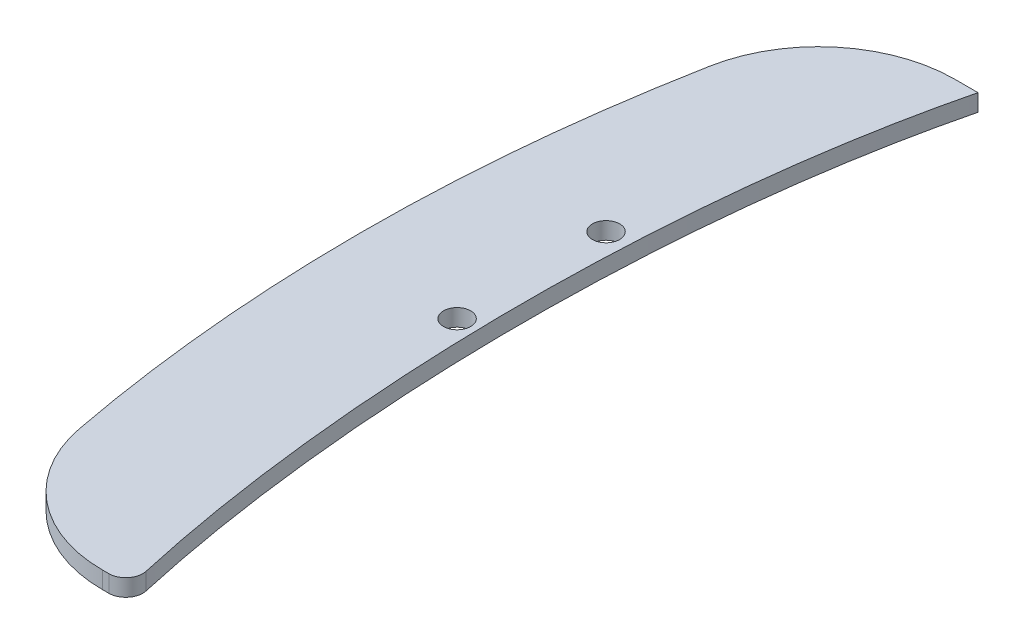
ISO-10303-21;
HEADER;
FILE_DESCRIPTION(('STEP AP214'),'2;1');
FILE_NAME('part.step','',(''),(''),'','','');
FILE_SCHEMA(('AUTOMOTIVE_DESIGN { 1 0 10303 214 1 1 1 1 }'));
ENDSEC;
DATA;
#1=APPLICATION_CONTEXT('core data for automotive mechanical design processes');
#2=APPLICATION_PROTOCOL_DEFINITION('international standard','automotive_design',2000,#1);
#3=PRODUCT_CONTEXT('',#1,'mechanical');
#4=PRODUCT('Part','Part','',(#3));
#5=PRODUCT_RELATED_PRODUCT_CATEGORY('part','',(#4));
#6=PRODUCT_DEFINITION_FORMATION('','',#4);
#7=PRODUCT_DEFINITION_CONTEXT('part definition',#1,'design');
#8=PRODUCT_DEFINITION('design','',#6,#7);
#9=PRODUCT_DEFINITION_SHAPE('','',#8);
#10=(LENGTH_UNIT() NAMED_UNIT(*) SI_UNIT(.MILLI.,.METRE.));
#11=(NAMED_UNIT(*) PLANE_ANGLE_UNIT() SI_UNIT($,.RADIAN.));
#12=(NAMED_UNIT(*) SI_UNIT($,.STERADIAN.) SOLID_ANGLE_UNIT());
#13=UNCERTAINTY_MEASURE_WITH_UNIT(LENGTH_MEASURE(1.E-05),#10,'distance_accuracy_value','');
#14=(GEOMETRIC_REPRESENTATION_CONTEXT(3) GLOBAL_UNCERTAINTY_ASSIGNED_CONTEXT((#13)) GLOBAL_UNIT_ASSIGNED_CONTEXT((#10,
#11,#12)) REPRESENTATION_CONTEXT('',''));
#15=CARTESIAN_POINT('',(0.,0.,0.));
#16=DIRECTION('',(0.,0.,1.));
#17=DIRECTION('',(1.,0.,0.));
#18=AXIS2_PLACEMENT_3D('',#15,#16,#17);
#19=CARTESIAN_POINT('',(7.98093404356032,2.5,-0.369809069035212));
#20=DIRECTION('',(0.,-1.,0.));
#21=DIRECTION('',(0.,0.,-1.));
#22=AXIS2_PLACEMENT_3D('',#19,#20,#21);
#23=PLANE('',#22);
#24=CARTESIAN_POINT('',(14.4139230516023,2.5,59.972626608733));
#25=CARTESIAN_POINT('',(10.3600323582731,2.5,41.9835802863605));
#26=CARTESIAN_POINT('',(5.80089976046676,2.5,-0.158887719398999));
#27=CARTESIAN_POINT('',(9.96190429503463,2.5,-43.1450411237033));
#28=CARTESIAN_POINT('',(14.6281507340815,2.5,-61.9777728446062));
#29=B_SPLINE_CURVE_WITH_KNOTS('',3,(#24,#25,#26,#27,#28),.UNSPECIFIED.,.F.,.F.,(4,1,4),(0.,
0.486126784039774,0.972253568079549),.UNSPECIFIED.);
#30=CARTESIAN_POINT('',(14.4139230516023,2.5,59.972626608733));
#31=VERTEX_POINT('',#30);
#32=CARTESIAN_POINT('',(14.6281507340815,2.5,-61.9777728446062));
#33=VERTEX_POINT('',#32);
#34=EDGE_CURVE('E166',#31,#33,#29,.T.);
#35=ORIENTED_EDGE('',*,*,#34,.T.);
#36=DIRECTION('',(-1.,0.,0.));
#37=VECTOR('',#36,1.);
#38=CARTESIAN_POINT('',(11.2219847975286,2.5,-61.9777728446062));
#39=LINE('',#38,#37);
#40=CARTESIAN_POINT('',(11.2219847975286,2.5,-61.9777728446062));
#41=VERTEX_POINT('',#40);
#42=EDGE_CURVE('E98',#33,#41,#39,.T.);
#43=ORIENTED_EDGE('',*,*,#42,.T.);
#44=CARTESIAN_POINT('',(11.2219847975286,2.5,-41.9777728446062));
#45=DIRECTION('',(0.,1.,0.));
#46=DIRECTION('',(0.,0.,-1.));
#47=AXIS2_PLACEMENT_3D('',#44,#45,#46);
#48=CIRCLE('',#47,20.);
#49=CARTESIAN_POINT('',(-8.43603740992544,2.5,-45.660457041119));
#50=VERTEX_POINT('',#49);
#51=EDGE_CURVE('E183',#41,#50,#48,.T.);
#52=ORIENTED_EDGE('',*,*,#51,.T.);
#53=CARTESIAN_POINT('',(-8.43603740992544,2.5,-45.660457041119));
#54=CARTESIAN_POINT('',(-10.9283676737998,2.5,-32.3564969236739));
#55=CARTESIAN_POINT('',(-14.334494691742,2.5,-2.38288746136294));
#56=CARTESIAN_POINT('',(-11.9604730634743,2.5,29.4177292586213));
#57=CARTESIAN_POINT('',(-8.59564883827233,2.5,46.8191851875977));
#58=B_SPLINE_CURVE_WITH_KNOTS('',3,(#53,#54,#55,#56,#57),.UNSPECIFIED.,.F.,.F.,(4,1,4),
(0.126810365029956,0.438278247696197,0.866480416364856),.UNSPECIFIED.);
#59=CARTESIAN_POINT('',(-8.59564883827233,2.5,46.8191851875977));
#60=VERTEX_POINT('',#59);
#61=EDGE_CURVE('E114',#50,#60,#58,.T.);
#62=ORIENTED_EDGE('',*,*,#61,.T.);
#63=CARTESIAN_POINT('',(11.0406214211655,2.5,43.0222271553938));
#64=DIRECTION('',(0.,1.,0.));
#65=DIRECTION('',(0.,0.,1.));
#66=AXIS2_PLACEMENT_3D('',#63,#64,#65);
#67=CIRCLE('',#66,20.);
#68=CARTESIAN_POINT('',(11.0406214211655,2.5,63.0222271553938));
#69=VERTEX_POINT('',#68);
#70=EDGE_CURVE('E108',#60,#69,#67,.T.);
#71=ORIENTED_EDGE('',*,*,#70,.T.);
#72=DIRECTION('',(1.,0.,0.));
#73=VECTOR('',#72,1.);
#74=CARTESIAN_POINT('',(11.0406214211655,2.5,63.0222271553938));
#75=LINE('',#74,#73);
#76=CARTESIAN_POINT('',(11.9750833194529,2.5,63.0222271553938));
#77=VERTEX_POINT('',#76);
#78=EDGE_CURVE('E112',#69,#77,#75,.T.);
#79=ORIENTED_EDGE('',*,*,#78,.T.);
#80=CARTESIAN_POINT('',(11.9750833194529,2.5,60.5222271553938));
#81=DIRECTION('',(0.,1.,0.));
#82=DIRECTION('',(0.,0.,1.));
#83=AXIS2_PLACEMENT_3D('',#80,#81,#82);
#84=CIRCLE('',#83,2.49999999999999);
#85=EDGE_CURVE('E58',#77,#31,#84,.T.);
#86=ORIENTED_EDGE('',*,*,#85,.T.);
#87=EDGE_LOOP('',(#35,#43,#52,#62,#71,#79,#86));
#88=FACE_BOUND('',#87,.T.);
#89=CARTESIAN_POINT('',(5.00152215049819,2.5,-16.9777728446062));
#90=DIRECTION('',(0.,1.,0.));
#91=DIRECTION('',(0.,0.,1.));
#92=AXIS2_PLACEMENT_3D('',#89,#90,#91);
#93=CIRCLE('',#92,2.);
#94=CARTESIAN_POINT('',(5.00152215049819,2.5,-14.9777728446062));
#95=VERTEX_POINT('',#94);
#96=EDGE_CURVE('E143',#95,#95,#93,.T.);
#97=ORIENTED_EDGE('',*,*,#96,.F.);
#98=EDGE_LOOP('',(#97));
#99=FACE_BOUND('',#98,.T.);
#100=CARTESIAN_POINT('',(5.12533451729452,2.5,5.02187875485842));
#101=DIRECTION('',(0.,1.,0.));
#102=DIRECTION('',(0.,0.,1.));
#103=AXIS2_PLACEMENT_3D('',#100,#101,#102);
#104=CIRCLE('',#103,2.);
#105=CARTESIAN_POINT('',(5.12533451729452,2.5,7.02187875485842));
#106=VERTEX_POINT('',#105);
#107=EDGE_CURVE('E298',#106,#106,#104,.T.);
#108=ORIENTED_EDGE('',*,*,#107,.F.);
#109=EDGE_LOOP('',(#108));
#110=FACE_BOUND('',#109,.T.);
#111=ADVANCED_FACE('F39',(#88,#99,#110),#23,.F.);
#112=CARTESIAN_POINT('',(7.98093404356032,0.,-0.369809069035212));
#113=DIRECTION('',(0.,-1.,0.));
#114=DIRECTION('',(0.,0.,-1.));
#115=AXIS2_PLACEMENT_3D('',#112,#113,#114);
#116=PLANE('',#115);
#117=CARTESIAN_POINT('',(5.00152215049819,0.,-16.9777728446062));
#118=DIRECTION('',(0.,1.,0.));
#119=DIRECTION('',(0.,0.,1.));
#120=AXIS2_PLACEMENT_3D('',#117,#118,#119);
#121=CIRCLE('',#120,2.);
#122=CARTESIAN_POINT('',(5.00152215049819,0.,-14.9777728446062));
#123=VERTEX_POINT('',#122);
#124=EDGE_CURVE('E305',#123,#123,#121,.T.);
#125=ORIENTED_EDGE('',*,*,#124,.T.);
#126=EDGE_LOOP('',(#125));
#127=FACE_BOUND('',#126,.T.);
#128=CARTESIAN_POINT('',(14.4139230516023,0.,59.972626608733));
#129=CARTESIAN_POINT('',(10.3600323582731,0.,41.9835802863605));
#130=CARTESIAN_POINT('',(5.80089976046676,0.,-0.158887719398999));
#131=CARTESIAN_POINT('',(9.96190429503463,0.,-43.1450411237033));
#132=CARTESIAN_POINT('',(14.6281507340815,0.,-61.9777728446062));
#133=B_SPLINE_CURVE_WITH_KNOTS('',3,(#128,#129,#130,#131,#132),.UNSPECIFIED.,.F.,.F.,(4,1,4),
(0.,0.486126784039774,0.972253568079549),.UNSPECIFIED.);
#134=CARTESIAN_POINT('',(14.4139230516023,0.,59.972626608733));
#135=VERTEX_POINT('',#134);
#136=CARTESIAN_POINT('',(14.6281507340815,0.,-61.9777728446062));
#137=VERTEX_POINT('',#136);
#138=EDGE_CURVE('E136',#135,#137,#133,.T.);
#139=ORIENTED_EDGE('',*,*,#138,.F.);
#140=CARTESIAN_POINT('',(11.9750833194529,0.,60.5222271553938));
#141=DIRECTION('',(0.,1.,0.));
#142=DIRECTION('',(0.,0.,1.));
#143=AXIS2_PLACEMENT_3D('',#140,#141,#142);
#144=CIRCLE('',#143,2.49999999999999);
#145=CARTESIAN_POINT('',(11.9750833194529,0.,63.0222271553938));
#146=VERTEX_POINT('',#145);
#147=EDGE_CURVE('E90',#146,#135,#144,.T.);
#148=ORIENTED_EDGE('',*,*,#147,.F.);
#149=DIRECTION('',(1.,0.,0.));
#150=VECTOR('',#149,1.);
#151=CARTESIAN_POINT('',(11.0406214211655,0.,63.0222271553938));
#152=LINE('',#151,#150);
#153=CARTESIAN_POINT('',(11.0406214211655,0.,63.0222271553938));
#154=VERTEX_POINT('',#153);
#155=EDGE_CURVE('E84',#154,#146,#152,.T.);
#156=ORIENTED_EDGE('',*,*,#155,.F.);
#157=CARTESIAN_POINT('',(11.0406214211655,0.,43.0222271553938));
#158=DIRECTION('',(0.,1.,0.));
#159=DIRECTION('',(0.,0.,1.));
#160=AXIS2_PLACEMENT_3D('',#157,#158,#159);
#161=CIRCLE('',#160,20.);
#162=CARTESIAN_POINT('',(-8.59564883827233,0.,46.8191851875977));
#163=VERTEX_POINT('',#162);
#164=EDGE_CURVE('E123',#163,#154,#161,.T.);
#165=ORIENTED_EDGE('',*,*,#164,.F.);
#166=CARTESIAN_POINT('',(-8.43603740992544,0.,-45.660457041119));
#167=CARTESIAN_POINT('',(-10.9283676737998,0.,-32.3564969236739));
#168=CARTESIAN_POINT('',(-14.334494691742,0.,-2.38288746136294));
#169=CARTESIAN_POINT('',(-11.9604730634743,0.,29.4177292586213));
#170=CARTESIAN_POINT('',(-8.59564883827233,0.,46.8191851875977));
#171=B_SPLINE_CURVE_WITH_KNOTS('',3,(#166,#167,#168,#169,#170),.UNSPECIFIED.,.F.,.F.,(4,1,4),
(0.126810365029956,0.438278247696197,0.866480416364856),.UNSPECIFIED.);
#172=CARTESIAN_POINT('',(-8.43603740992544,0.,-45.660457041119));
#173=VERTEX_POINT('',#172);
#174=EDGE_CURVE('E152',#173,#163,#171,.T.);
#175=ORIENTED_EDGE('',*,*,#174,.F.);
#176=CARTESIAN_POINT('',(11.2219847975286,0.,-41.9777728446062));
#177=DIRECTION('',(0.,1.,0.));
#178=DIRECTION('',(0.,0.,-1.));
#179=AXIS2_PLACEMENT_3D('',#176,#177,#178);
#180=CIRCLE('',#179,20.);
#181=CARTESIAN_POINT('',(11.2219847975286,0.,-61.9777728446062));
#182=VERTEX_POINT('',#181);
#183=EDGE_CURVE('E149',#182,#173,#180,.T.);
#184=ORIENTED_EDGE('',*,*,#183,.F.);
#185=DIRECTION('',(-1.,0.,0.));
#186=VECTOR('',#185,1.);
#187=CARTESIAN_POINT('',(11.2219847975286,0.,-61.9777728446062));
#188=LINE('',#187,#186);
#189=EDGE_CURVE('E142',#137,#182,#188,.T.);
#190=ORIENTED_EDGE('',*,*,#189,.F.);
#191=EDGE_LOOP('',(#139,#148,#156,#165,#175,#184,#190));
#192=FACE_BOUND('',#191,.T.);
#193=CARTESIAN_POINT('',(5.12533451729452,0.,5.02187875485842));
#194=DIRECTION('',(0.,1.,0.));
#195=DIRECTION('',(0.,0.,1.));
#196=AXIS2_PLACEMENT_3D('',#193,#194,#195);
#197=CIRCLE('',#196,2.);
#198=CARTESIAN_POINT('',(5.12533451729452,0.,7.02187875485842));
#199=VERTEX_POINT('',#198);
#200=EDGE_CURVE('E301',#199,#199,#197,.T.);
#201=ORIENTED_EDGE('',*,*,#200,.T.);
#202=EDGE_LOOP('',(#201));
#203=FACE_BOUND('',#202,.T.);
#204=ADVANCED_FACE('F187',(#127,#192,#203),#116,.T.);
#205=DIRECTION('',(0.,-1.,0.));
#206=VECTOR('',#205,1.);
#207=SURFACE_OF_LINEAR_EXTRUSION('',#29,#206);
#208=ORIENTED_EDGE('',*,*,#138,.T.);
#209=DIRECTION('',(0.,-1.,0.));
#210=VECTOR('',#209,1.);
#211=CARTESIAN_POINT('',(14.6281507340815,2.5,-61.9777728446062));
#212=LINE('',#211,#210);
#213=EDGE_CURVE('E11',#33,#137,#212,.T.);
#214=ORIENTED_EDGE('',*,*,#213,.F.);
#215=ORIENTED_EDGE('',*,*,#34,.F.);
#216=DIRECTION('',(0.,-1.,0.));
#217=VECTOR('',#216,1.);
#218=CARTESIAN_POINT('',(14.4139230516023,2.5,59.972626608733));
#219=LINE('',#218,#217);
#220=EDGE_CURVE('E132',#31,#135,#219,.T.);
#221=ORIENTED_EDGE('',*,*,#220,.T.);
#222=EDGE_LOOP('',(#208,#214,#215,#221));
#223=FACE_BOUND('',#222,.T.);
#224=ADVANCED_FACE('F41',(#223),#207,.F.);
#225=CARTESIAN_POINT('',(11.2219847975286,2.5,-61.9777728446062));
#226=DIRECTION('',(0.,0.,1.));
#227=DIRECTION('',(1.,0.,0.));
#228=AXIS2_PLACEMENT_3D('',#225,#226,#227);
#229=PLANE('',#228);
#230=ORIENTED_EDGE('',*,*,#189,.T.);
#231=DIRECTION('',(0.,-1.,0.));
#232=VECTOR('',#231,1.);
#233=CARTESIAN_POINT('',(11.2219847975286,2.5,-61.9777728446062));
#234=LINE('',#233,#232);
#235=EDGE_CURVE('E50',#41,#182,#234,.T.);
#236=ORIENTED_EDGE('',*,*,#235,.F.);
#237=ORIENTED_EDGE('',*,*,#42,.F.);
#238=ORIENTED_EDGE('',*,*,#213,.T.);
#239=EDGE_LOOP('',(#230,#236,#237,#238));
#240=FACE_BOUND('',#239,.T.);
#241=ADVANCED_FACE('F207',(#240),#229,.F.);
#242=CARTESIAN_POINT('',(11.2219847975286,2.5,-41.9777728446062));
#243=DIRECTION('',(0.,-1.,0.));
#244=DIRECTION('',(0.,0.,-1.));
#245=AXIS2_PLACEMENT_3D('',#242,#243,#244);
#246=CYLINDRICAL_SURFACE('',#245,20.);
#247=ORIENTED_EDGE('',*,*,#183,.T.);
#248=DIRECTION('',(0.,-1.,0.));
#249=VECTOR('',#248,1.);
#250=CARTESIAN_POINT('',(-8.43603740992544,2.5,-45.660457041119));
#251=LINE('',#250,#249);
#252=EDGE_CURVE('E173',#50,#173,#251,.T.);
#253=ORIENTED_EDGE('',*,*,#252,.F.);
#254=ORIENTED_EDGE('',*,*,#51,.F.);
#255=ORIENTED_EDGE('',*,*,#235,.T.);
#256=EDGE_LOOP('',(#247,#253,#254,#255));
#257=FACE_BOUND('',#256,.T.);
#258=ADVANCED_FACE('F181',(#257),#246,.T.);
#259=DIRECTION('',(0.,-1.,0.));
#260=VECTOR('',#259,1.);
#261=SURFACE_OF_LINEAR_EXTRUSION('',#58,#260);
#262=ORIENTED_EDGE('',*,*,#174,.T.);
#263=DIRECTION('',(0.,-1.,0.));
#264=VECTOR('',#263,1.);
#265=CARTESIAN_POINT('',(-8.59564883827233,2.5,46.8191851875977));
#266=LINE('',#265,#264);
#267=EDGE_CURVE('E125',#60,#163,#266,.T.);
#268=ORIENTED_EDGE('',*,*,#267,.F.);
#269=ORIENTED_EDGE('',*,*,#61,.F.);
#270=ORIENTED_EDGE('',*,*,#252,.T.);
#271=EDGE_LOOP('',(#262,#268,#269,#270));
#272=FACE_BOUND('',#271,.T.);
#273=ADVANCED_FACE('F190',(#272),#261,.F.);
#274=CARTESIAN_POINT('',(11.0406214211655,2.5,43.0222271553938));
#275=DIRECTION('',(0.,-1.,0.));
#276=DIRECTION('',(0.,0.,-1.));
#277=AXIS2_PLACEMENT_3D('',#274,#275,#276);
#278=CYLINDRICAL_SURFACE('',#277,20.);
#279=ORIENTED_EDGE('',*,*,#164,.T.);
#280=DIRECTION('',(0.,-1.,0.));
#281=VECTOR('',#280,1.);
#282=CARTESIAN_POINT('',(11.0406214211655,2.5,63.0222271553938));
#283=LINE('',#282,#281);
#284=EDGE_CURVE('E120',#69,#154,#283,.T.);
#285=ORIENTED_EDGE('',*,*,#284,.F.);
#286=ORIENTED_EDGE('',*,*,#70,.F.);
#287=ORIENTED_EDGE('',*,*,#267,.T.);
#288=EDGE_LOOP('',(#279,#285,#286,#287));
#289=FACE_BOUND('',#288,.T.);
#290=ADVANCED_FACE('F121',(#289),#278,.T.);
#291=CARTESIAN_POINT('',(11.0406214211655,2.5,63.0222271553938));
#292=DIRECTION('',(0.,0.,-1.));
#293=DIRECTION('',(-1.,0.,0.));
#294=AXIS2_PLACEMENT_3D('',#291,#292,#293);
#295=PLANE('',#294);
#296=ORIENTED_EDGE('',*,*,#155,.T.);
#297=DIRECTION('',(0.,-1.,0.));
#298=VECTOR('',#297,1.);
#299=CARTESIAN_POINT('',(11.9750833194529,2.5,63.0222271553938));
#300=LINE('',#299,#298);
#301=EDGE_CURVE('E126',#77,#146,#300,.T.);
#302=ORIENTED_EDGE('',*,*,#301,.F.);
#303=ORIENTED_EDGE('',*,*,#78,.F.);
#304=ORIENTED_EDGE('',*,*,#284,.T.);
#305=EDGE_LOOP('',(#296,#302,#303,#304));
#306=FACE_BOUND('',#305,.T.);
#307=ADVANCED_FACE('F128',(#306),#295,.F.);
#308=CARTESIAN_POINT('',(11.9750833194529,2.5,60.5222271553938));
#309=DIRECTION('',(0.,-1.,0.));
#310=DIRECTION('',(0.,0.,-1.));
#311=AXIS2_PLACEMENT_3D('',#308,#309,#310);
#312=CYLINDRICAL_SURFACE('',#311,2.49999999999999);
#313=ORIENTED_EDGE('',*,*,#147,.T.);
#314=ORIENTED_EDGE('',*,*,#220,.F.);
#315=ORIENTED_EDGE('',*,*,#85,.F.);
#316=ORIENTED_EDGE('',*,*,#301,.T.);
#317=EDGE_LOOP('',(#313,#314,#315,#316));
#318=FACE_BOUND('',#317,.T.);
#319=ADVANCED_FACE('F224',(#318),#312,.T.);
#320=CARTESIAN_POINT('',(5.00152215049819,2.5,-16.9777728446062));
#321=DIRECTION('',(0.,-1.,0.));
#322=DIRECTION('',(0.,0.,-1.));
#323=AXIS2_PLACEMENT_3D('',#320,#321,#322);
#324=CYLINDRICAL_SURFACE('',#323,2.);
#325=ORIENTED_EDGE('',*,*,#96,.T.);
#326=EDGE_LOOP('',(#325));
#327=FACE_BOUND('',#326,.T.);
#328=ORIENTED_EDGE('',*,*,#124,.F.);
#329=EDGE_LOOP('',(#328));
#330=FACE_BOUND('',#329,.T.);
#331=ADVANCED_FACE('F221',(#327,#330),#324,.F.);
#332=CARTESIAN_POINT('',(5.12533451729452,2.5,5.02187875485842));
#333=DIRECTION('',(0.,-1.,0.));
#334=DIRECTION('',(0.,0.,-1.));
#335=AXIS2_PLACEMENT_3D('',#332,#333,#334);
#336=CYLINDRICAL_SURFACE('',#335,2.);
#337=ORIENTED_EDGE('',*,*,#107,.T.);
#338=EDGE_LOOP('',(#337));
#339=FACE_BOUND('',#338,.T.);
#340=ORIENTED_EDGE('',*,*,#200,.F.);
#341=EDGE_LOOP('',(#340));
#342=FACE_BOUND('',#341,.T.);
#343=ADVANCED_FACE('F283',(#339,#342),#336,.F.);
#344=CLOSED_SHELL('',(#111,#204,#224,#241,#258,#273,#290,#307,#319,#331,#343));
#345=MANIFOLD_SOLID_BREP('B2',#344);
#346=ADVANCED_BREP_SHAPE_REPRESENTATION('',(#18,#345),#14);
#347=SHAPE_DEFINITION_REPRESENTATION(#9,#346);
ENDSEC;
END-ISO-10303-21;
